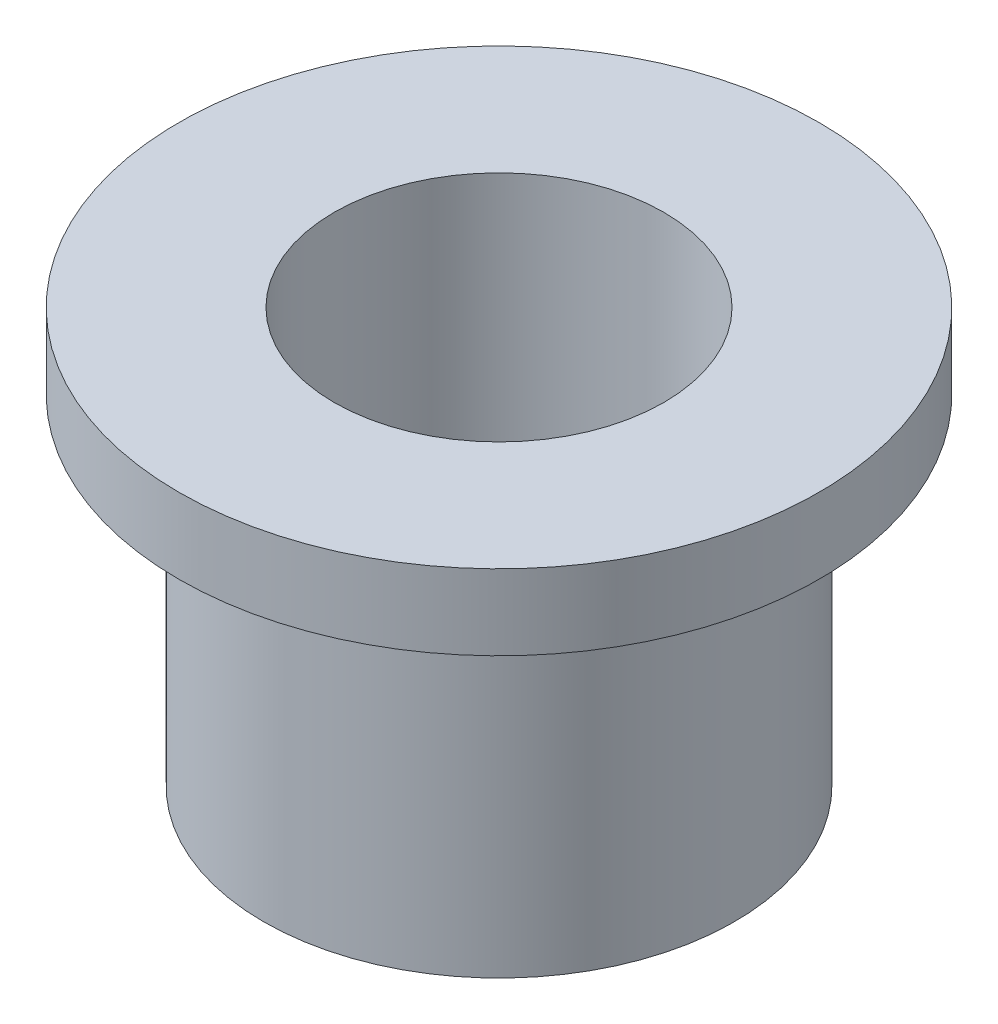
ISO-10303-21;
HEADER;
FILE_DESCRIPTION(('STEP AP214'),'2;1');
FILE_NAME('part.step','',(''),(''),'','','');
FILE_SCHEMA(('AUTOMOTIVE_DESIGN { 1 0 10303 214 1 1 1 1 }'));
ENDSEC;
DATA;
#1=APPLICATION_CONTEXT('core data for automotive mechanical design processes');
#2=APPLICATION_PROTOCOL_DEFINITION('international standard','automotive_design',2000,#1);
#3=PRODUCT_CONTEXT('',#1,'mechanical');
#4=PRODUCT('Part','Part','',(#3));
#5=PRODUCT_RELATED_PRODUCT_CATEGORY('part','',(#4));
#6=PRODUCT_DEFINITION_FORMATION('','',#4);
#7=PRODUCT_DEFINITION_CONTEXT('part definition',#1,'design');
#8=PRODUCT_DEFINITION('design','',#6,#7);
#9=PRODUCT_DEFINITION_SHAPE('','',#8);
#10=(LENGTH_UNIT() NAMED_UNIT(*) SI_UNIT(.MILLI.,.METRE.));
#11=(NAMED_UNIT(*) PLANE_ANGLE_UNIT() SI_UNIT($,.RADIAN.));
#12=(NAMED_UNIT(*) SI_UNIT($,.STERADIAN.) SOLID_ANGLE_UNIT());
#13=UNCERTAINTY_MEASURE_WITH_UNIT(LENGTH_MEASURE(1.E-05),#10,'distance_accuracy_value','');
#14=(GEOMETRIC_REPRESENTATION_CONTEXT(3) GLOBAL_UNCERTAINTY_ASSIGNED_CONTEXT((#13)) GLOBAL_UNIT_ASSIGNED_CONTEXT((#10,
#11,#12)) REPRESENTATION_CONTEXT('',''));
#15=CARTESIAN_POINT('',(0.,0.,0.));
#16=DIRECTION('',(0.,0.,1.));
#17=DIRECTION('',(1.,0.,0.));
#18=AXIS2_PLACEMENT_3D('',#15,#16,#17);
#19=CARTESIAN_POINT('',(0.,0.,0.));
#20=DIRECTION('',(0.,1.,0.));
#21=DIRECTION('',(0.,0.,1.));
#22=AXIS2_PLACEMENT_3D('',#19,#20,#21);
#23=PLANE('',#22);
#24=CARTESIAN_POINT('',(0.,0.,0.));
#25=DIRECTION('',(0.,1.,0.));
#26=DIRECTION('',(0.,0.,1.));
#27=AXIS2_PLACEMENT_3D('',#24,#25,#26);
#28=CIRCLE('',#27,34.);
#29=CARTESIAN_POINT('',(0.,0.,34.));
#30=VERTEX_POINT('',#29);
#31=EDGE_CURVE('E55',#30,#30,#28,.T.);
#32=ORIENTED_EDGE('',*,*,#31,.T.);
#33=EDGE_LOOP('',(#32));
#34=FACE_BOUND('',#33,.T.);
#35=CARTESIAN_POINT('',(0.,0.,0.));
#36=DIRECTION('',(0.,1.,0.));
#37=DIRECTION('',(0.,0.,1.));
#38=AXIS2_PLACEMENT_3D('',#35,#36,#37);
#39=CIRCLE('',#38,17.5);
#40=CARTESIAN_POINT('',(0.,0.,17.5));
#41=VERTEX_POINT('',#40);
#42=EDGE_CURVE('E10',#41,#41,#39,.T.);
#43=ORIENTED_EDGE('',*,*,#42,.F.);
#44=EDGE_LOOP('',(#43));
#45=FACE_BOUND('',#44,.T.);
#46=ADVANCED_FACE('F33',(#34,#45),#23,.T.);
#47=CARTESIAN_POINT('',(0.,24.1578947368421,0.));
#48=DIRECTION('',(0.,1.,0.));
#49=DIRECTION('',(0.,0.,1.));
#50=AXIS2_PLACEMENT_3D('',#47,#48,#49);
#51=CYLINDRICAL_SURFACE('',#50,17.5);
#52=CARTESIAN_POINT('',(0.,-44.,0.));
#53=DIRECTION('',(0.,1.,0.));
#54=DIRECTION('',(0.,0.,1.));
#55=AXIS2_PLACEMENT_3D('',#52,#53,#54);
#56=CIRCLE('',#55,17.5);
#57=CARTESIAN_POINT('',(0.,-44.,17.5));
#58=VERTEX_POINT('',#57);
#59=EDGE_CURVE('E39',#58,#58,#56,.T.);
#60=ORIENTED_EDGE('',*,*,#59,.F.);
#61=EDGE_LOOP('',(#60));
#62=FACE_BOUND('',#61,.T.);
#63=ORIENTED_EDGE('',*,*,#42,.T.);
#64=EDGE_LOOP('',(#63));
#65=FACE_BOUND('',#64,.T.);
#66=ADVANCED_FACE('F73',(#62,#65),#51,.F.);
#67=CARTESIAN_POINT('',(0.,-44.,0.));
#68=DIRECTION('',(0.,-1.,0.));
#69=DIRECTION('',(0.,0.,-1.));
#70=AXIS2_PLACEMENT_3D('',#67,#68,#69);
#71=PLANE('',#70);
#72=ORIENTED_EDGE('',*,*,#59,.T.);
#73=EDGE_LOOP('',(#72));
#74=FACE_BOUND('',#73,.T.);
#75=CARTESIAN_POINT('',(0.,-44.,0.));
#76=DIRECTION('',(0.,1.,0.));
#77=DIRECTION('',(0.,0.,1.));
#78=AXIS2_PLACEMENT_3D('',#75,#76,#77);
#79=CIRCLE('',#78,25.);
#80=CARTESIAN_POINT('',(0.,-44.,25.));
#81=VERTEX_POINT('',#80);
#82=EDGE_CURVE('E43',#81,#81,#79,.T.);
#83=ORIENTED_EDGE('',*,*,#82,.F.);
#84=EDGE_LOOP('',(#83));
#85=FACE_BOUND('',#84,.T.);
#86=ADVANCED_FACE('F77',(#74,#85),#71,.T.);
#87=CARTESIAN_POINT('',(0.,24.1578947368421,0.));
#88=DIRECTION('',(0.,1.,0.));
#89=DIRECTION('',(0.,0.,1.));
#90=AXIS2_PLACEMENT_3D('',#87,#88,#89);
#91=CYLINDRICAL_SURFACE('',#90,25.);
#92=ORIENTED_EDGE('',*,*,#82,.T.);
#93=EDGE_LOOP('',(#92));
#94=FACE_BOUND('',#93,.T.);
#95=CARTESIAN_POINT('',(0.,-8.,0.));
#96=DIRECTION('',(0.,1.,0.));
#97=DIRECTION('',(0.,0.,1.));
#98=AXIS2_PLACEMENT_3D('',#95,#96,#97);
#99=CIRCLE('',#98,25.);
#100=CARTESIAN_POINT('',(0.,-8.,25.));
#101=VERTEX_POINT('',#100);
#102=EDGE_CURVE('E47',#101,#101,#99,.T.);
#103=ORIENTED_EDGE('',*,*,#102,.F.);
#104=EDGE_LOOP('',(#103));
#105=FACE_BOUND('',#104,.T.);
#106=ADVANCED_FACE('F69',(#94,#105),#91,.T.);
#107=CARTESIAN_POINT('',(0.,-8.,0.));
#108=DIRECTION('',(0.,-1.,0.));
#109=DIRECTION('',(0.,0.,-1.));
#110=AXIS2_PLACEMENT_3D('',#107,#108,#109);
#111=PLANE('',#110);
#112=ORIENTED_EDGE('',*,*,#102,.T.);
#113=EDGE_LOOP('',(#112));
#114=FACE_BOUND('',#113,.T.);
#115=CARTESIAN_POINT('',(0.,-8.,0.));
#116=DIRECTION('',(0.,1.,0.));
#117=DIRECTION('',(0.,0.,1.));
#118=AXIS2_PLACEMENT_3D('',#115,#116,#117);
#119=CIRCLE('',#118,34.);
#120=CARTESIAN_POINT('',(0.,-8.,34.));
#121=VERTEX_POINT('',#120);
#122=EDGE_CURVE('E52',#121,#121,#119,.T.);
#123=ORIENTED_EDGE('',*,*,#122,.F.);
#124=EDGE_LOOP('',(#123));
#125=FACE_BOUND('',#124,.T.);
#126=ADVANCED_FACE('F63',(#114,#125),#111,.T.);
#127=CARTESIAN_POINT('',(0.,24.1578947368421,0.));
#128=DIRECTION('',(0.,1.,0.));
#129=DIRECTION('',(0.,0.,1.));
#130=AXIS2_PLACEMENT_3D('',#127,#128,#129);
#131=CYLINDRICAL_SURFACE('',#130,34.);
#132=ORIENTED_EDGE('',*,*,#122,.T.);
#133=EDGE_LOOP('',(#132));
#134=FACE_BOUND('',#133,.T.);
#135=ORIENTED_EDGE('',*,*,#31,.F.);
#136=EDGE_LOOP('',(#135));
#137=FACE_BOUND('',#136,.T.);
#138=ADVANCED_FACE('F61',(#134,#137),#131,.T.);
#139=CLOSED_SHELL('',(#46,#66,#86,#106,#126,#138));
#140=MANIFOLD_SOLID_BREP('B2',#139);
#141=ADVANCED_BREP_SHAPE_REPRESENTATION('',(#18,#140),#14);
#142=SHAPE_DEFINITION_REPRESENTATION(#9,#141);
ENDSEC;
END-ISO-10303-21;
